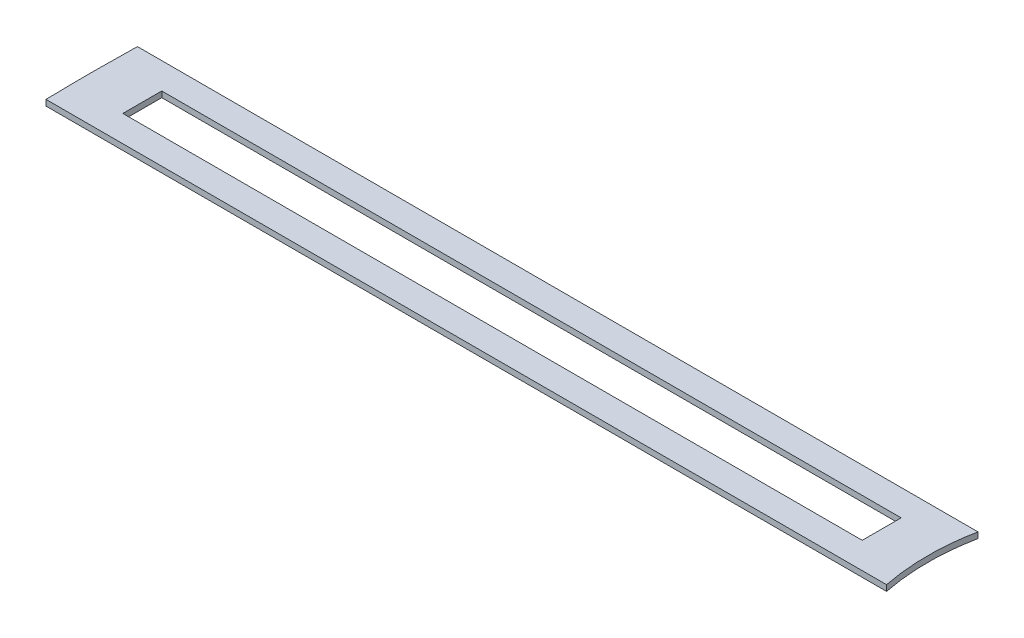
ISO-10303-21;
HEADER;
FILE_DESCRIPTION(('STEP AP214'),'2;1');
FILE_NAME('part.step','',(''),(''),'','','');
FILE_SCHEMA(('AUTOMOTIVE_DESIGN { 1 0 10303 214 1 1 1 1 }'));
ENDSEC;
DATA;
#1=APPLICATION_CONTEXT('core data for automotive mechanical design processes');
#2=APPLICATION_PROTOCOL_DEFINITION('international standard','automotive_design',2000,#1);
#3=PRODUCT_CONTEXT('',#1,'mechanical');
#4=PRODUCT('Part','Part','',(#3));
#5=PRODUCT_RELATED_PRODUCT_CATEGORY('part','',(#4));
#6=PRODUCT_DEFINITION_FORMATION('','',#4);
#7=PRODUCT_DEFINITION_CONTEXT('part definition',#1,'design');
#8=PRODUCT_DEFINITION('design','',#6,#7);
#9=PRODUCT_DEFINITION_SHAPE('','',#8);
#10=(LENGTH_UNIT() NAMED_UNIT(*) SI_UNIT(.MILLI.,.METRE.));
#11=(NAMED_UNIT(*) PLANE_ANGLE_UNIT() SI_UNIT($,.RADIAN.));
#12=(NAMED_UNIT(*) SI_UNIT($,.STERADIAN.) SOLID_ANGLE_UNIT());
#13=UNCERTAINTY_MEASURE_WITH_UNIT(LENGTH_MEASURE(1.E-05),#10,'distance_accuracy_value','');
#14=(GEOMETRIC_REPRESENTATION_CONTEXT(3) GLOBAL_UNCERTAINTY_ASSIGNED_CONTEXT((#13)) GLOBAL_UNIT_ASSIGNED_CONTEXT((#10,
#11,#12)) REPRESENTATION_CONTEXT('',''));
#15=CARTESIAN_POINT('',(0.,0.,0.));
#16=DIRECTION('',(0.,0.,1.));
#17=DIRECTION('',(1.,0.,0.));
#18=AXIS2_PLACEMENT_3D('',#15,#16,#17);
#19=CARTESIAN_POINT('',(274.231366276179,1.5,1.2110701569534E-13));
#20=DIRECTION('',(0.,1.,0.));
#21=DIRECTION('',(0.,0.,1.));
#22=AXIS2_PLACEMENT_3D('',#19,#20,#21);
#23=PLANE('',#22);
#24=CARTESIAN_POINT('',(274.231366276179,1.5,1.2110701569534E-13));
#25=DIRECTION('',(0.,-1.,0.));
#26=DIRECTION('',(0.,0.,1.));
#27=AXIS2_PLACEMENT_3D('',#24,#25,#26);
#28=ELLIPSE('',#27,85.6389749867497,60.5558999469955);
#29=CARTESIAN_POINT('',(216.,1.5,23.5000000000001));
#30=VERTEX_POINT('',#29);
#31=CARTESIAN_POINT('',(216.,1.5,-23.5));
#32=VERTEX_POINT('',#31);
#33=EDGE_CURVE('E134',#30,#32,#28,.T.);
#34=ORIENTED_EDGE('',*,*,#33,.T.);
#35=DIRECTION('',(-1.,0.,0.));
#36=VECTOR('',#35,1.);
#37=CARTESIAN_POINT('',(-215.999999999999,1.5,-23.5000000000002));
#38=LINE('',#37,#36);
#39=CARTESIAN_POINT('',(-215.999999999997,1.5,-23.5000000000002));
#40=VERTEX_POINT('',#39);
#41=EDGE_CURVE('E138',#32,#40,#38,.T.);
#42=ORIENTED_EDGE('',*,*,#41,.T.);
#43=CARTESIAN_POINT('',(278.260597063814,1.5,0.));
#44=DIRECTION('',(0.,1.,0.));
#45=DIRECTION('',(0.,0.,1.));
#46=AXIS2_PLACEMENT_3D('',#43,#44,#45);
#47=ELLIPSE('',#46,699.384962391783,494.539849567125);
#48=CARTESIAN_POINT('',(-216.,1.5,23.4999999999999));
#49=VERTEX_POINT('',#48);
#50=EDGE_CURVE('E141',#40,#49,#47,.T.);
#51=ORIENTED_EDGE('',*,*,#50,.T.);
#52=DIRECTION('',(1.,0.,0.));
#53=VECTOR('',#52,1.);
#54=CARTESIAN_POINT('',(216.,1.5,23.5000000000001));
#55=LINE('',#54,#53);
#56=EDGE_CURVE('E144',#49,#30,#55,.T.);
#57=ORIENTED_EDGE('',*,*,#56,.T.);
#58=EDGE_LOOP('',(#34,#42,#51,#57));
#59=FACE_BOUND('',#58,.T.);
#60=DIRECTION('',(-1.,0.,0.));
#61=VECTOR('',#60,1.);
#62=CARTESIAN_POINT('',(-190.,1.5,-10.));
#63=LINE('',#62,#61);
#64=CARTESIAN_POINT('',(190.,1.5,-10.));
#65=VERTEX_POINT('',#64);
#66=CARTESIAN_POINT('',(-190.,1.5,-10.));
#67=VERTEX_POINT('',#66);
#68=EDGE_CURVE('E107',#65,#67,#63,.T.);
#69=ORIENTED_EDGE('',*,*,#68,.F.);
#70=DIRECTION('',(0.,0.,-1.));
#71=VECTOR('',#70,1.);
#72=CARTESIAN_POINT('',(190.,1.5,10.));
#73=LINE('',#72,#71);
#74=CARTESIAN_POINT('',(190.,1.5,10.));
#75=VERTEX_POINT('',#74);
#76=EDGE_CURVE('E99',#75,#65,#73,.T.);
#77=ORIENTED_EDGE('',*,*,#76,.F.);
#78=DIRECTION('',(1.,0.,0.));
#79=VECTOR('',#78,1.);
#80=CARTESIAN_POINT('',(-190.,1.5,10.));
#81=LINE('',#80,#79);
#82=CARTESIAN_POINT('',(-190.,1.5,10.));
#83=VERTEX_POINT('',#82);
#84=EDGE_CURVE('E121',#83,#75,#81,.T.);
#85=ORIENTED_EDGE('',*,*,#84,.F.);
#86=DIRECTION('',(0.,0.,1.));
#87=VECTOR('',#86,1.);
#88=CARTESIAN_POINT('',(-190.,1.5,10.));
#89=LINE('',#88,#87);
#90=EDGE_CURVE('E119',#67,#83,#89,.T.);
#91=ORIENTED_EDGE('',*,*,#90,.F.);
#92=EDGE_LOOP('',(#69,#77,#85,#91));
#93=FACE_BOUND('',#92,.T.);
#94=ADVANCED_FACE('F33',(#59,#93),#23,.T.);
#95=CARTESIAN_POINT('',(274.231366276179,-1.5,1.2110701569534E-13));
#96=DIRECTION('',(0.,1.,0.));
#97=DIRECTION('',(0.,0.,1.));
#98=AXIS2_PLACEMENT_3D('',#95,#96,#97);
#99=PLANE('',#98);
#100=CARTESIAN_POINT('',(274.231366276179,-1.5,1.2110701569534E-13));
#101=DIRECTION('',(0.,-1.,0.));
#102=DIRECTION('',(0.,0.,1.));
#103=AXIS2_PLACEMENT_3D('',#100,#101,#102);
#104=ELLIPSE('',#103,85.6389749867497,60.5558999469955);
#105=CARTESIAN_POINT('',(216.,-1.5,23.5000000000001));
#106=VERTEX_POINT('',#105);
#107=CARTESIAN_POINT('',(216.,-1.5,-23.5));
#108=VERTEX_POINT('',#107);
#109=EDGE_CURVE('E115',#106,#108,#104,.T.);
#110=ORIENTED_EDGE('',*,*,#109,.F.);
#111=DIRECTION('',(1.,0.,0.));
#112=VECTOR('',#111,1.);
#113=CARTESIAN_POINT('',(216.,-1.5,23.5000000000001));
#114=LINE('',#113,#112);
#115=CARTESIAN_POINT('',(-216.,-1.5,23.4999999999999));
#116=VERTEX_POINT('',#115);
#117=EDGE_CURVE('E139',#116,#106,#114,.T.);
#118=ORIENTED_EDGE('',*,*,#117,.F.);
#119=CARTESIAN_POINT('',(278.260597063814,-1.5,0.));
#120=DIRECTION('',(0.,1.,0.));
#121=DIRECTION('',(0.,0.,1.));
#122=AXIS2_PLACEMENT_3D('',#119,#120,#121);
#123=ELLIPSE('',#122,699.384962391783,494.539849567125);
#124=CARTESIAN_POINT('',(-215.999999999997,-1.5,-23.5000000000002));
#125=VERTEX_POINT('',#124);
#126=EDGE_CURVE('E250',#125,#116,#123,.T.);
#127=ORIENTED_EDGE('',*,*,#126,.F.);
#128=DIRECTION('',(-1.,0.,0.));
#129=VECTOR('',#128,1.);
#130=CARTESIAN_POINT('',(-215.999999999999,-1.5,-23.5000000000002));
#131=LINE('',#130,#129);
#132=EDGE_CURVE('E255',#108,#125,#131,.T.);
#133=ORIENTED_EDGE('',*,*,#132,.F.);
#134=EDGE_LOOP('',(#110,#118,#127,#133));
#135=FACE_BOUND('',#134,.T.);
#136=DIRECTION('',(0.,0.,-1.));
#137=VECTOR('',#136,1.);
#138=CARTESIAN_POINT('',(190.,-1.5,10.));
#139=LINE('',#138,#137);
#140=CARTESIAN_POINT('',(190.,-1.5,10.));
#141=VERTEX_POINT('',#140);
#142=CARTESIAN_POINT('',(190.,-1.5,-10.));
#143=VERTEX_POINT('',#142);
#144=EDGE_CURVE('E57',#141,#143,#139,.T.);
#145=ORIENTED_EDGE('',*,*,#144,.T.);
#146=DIRECTION('',(-1.,0.,0.));
#147=VECTOR('',#146,1.);
#148=CARTESIAN_POINT('',(-190.,-1.5,-10.));
#149=LINE('',#148,#147);
#150=CARTESIAN_POINT('',(-190.,-1.5,-10.));
#151=VERTEX_POINT('',#150);
#152=EDGE_CURVE('E114',#143,#151,#149,.T.);
#153=ORIENTED_EDGE('',*,*,#152,.T.);
#154=DIRECTION('',(0.,0.,1.));
#155=VECTOR('',#154,1.);
#156=CARTESIAN_POINT('',(-190.,-1.5,10.));
#157=LINE('',#156,#155);
#158=CARTESIAN_POINT('',(-190.,-1.5,10.));
#159=VERTEX_POINT('',#158);
#160=EDGE_CURVE('E127',#151,#159,#157,.T.);
#161=ORIENTED_EDGE('',*,*,#160,.T.);
#162=DIRECTION('',(1.,0.,0.));
#163=VECTOR('',#162,1.);
#164=CARTESIAN_POINT('',(-190.,-1.5,10.));
#165=LINE('',#164,#163);
#166=EDGE_CURVE('E108',#159,#141,#165,.T.);
#167=ORIENTED_EDGE('',*,*,#166,.T.);
#168=EDGE_LOOP('',(#145,#153,#161,#167));
#169=FACE_BOUND('',#168,.T.);
#170=ADVANCED_FACE('F159',(#135,#169),#99,.F.);
#171=DIRECTION('',(0.,-1.,0.));
#172=VECTOR('',#171,1.);
#173=SURFACE_OF_LINEAR_EXTRUSION('',#28,#172);
#174=ORIENTED_EDGE('',*,*,#109,.T.);
#175=DIRECTION('',(0.,-1.,0.));
#176=VECTOR('',#175,1.);
#177=CARTESIAN_POINT('',(216.,1.5,-23.5));
#178=LINE('',#177,#176);
#179=EDGE_CURVE('E11',#32,#108,#178,.T.);
#180=ORIENTED_EDGE('',*,*,#179,.F.);
#181=ORIENTED_EDGE('',*,*,#33,.F.);
#182=DIRECTION('',(0.,-1.,0.));
#183=VECTOR('',#182,1.);
#184=CARTESIAN_POINT('',(216.,1.5,23.5000000000001));
#185=LINE('',#184,#183);
#186=EDGE_CURVE('E244',#30,#106,#185,.T.);
#187=ORIENTED_EDGE('',*,*,#186,.T.);
#188=EDGE_LOOP('',(#174,#180,#181,#187));
#189=FACE_BOUND('',#188,.T.);
#190=ADVANCED_FACE('F35',(#189),#173,.F.);
#191=CARTESIAN_POINT('',(-215.999999999999,1.5,-23.5000000000002));
#192=DIRECTION('',(0.,0.,1.));
#193=DIRECTION('',(1.,0.,0.));
#194=AXIS2_PLACEMENT_3D('',#191,#192,#193);
#195=PLANE('',#194);
#196=ORIENTED_EDGE('',*,*,#132,.T.);
#197=DIRECTION('',(0.,-1.,0.));
#198=VECTOR('',#197,1.);
#199=CARTESIAN_POINT('',(-215.999999999997,1.5,-23.5000000000002));
#200=LINE('',#199,#198);
#201=EDGE_CURVE('E42',#40,#125,#200,.T.);
#202=ORIENTED_EDGE('',*,*,#201,.F.);
#203=ORIENTED_EDGE('',*,*,#41,.F.);
#204=ORIENTED_EDGE('',*,*,#179,.T.);
#205=EDGE_LOOP('',(#196,#202,#203,#204));
#206=FACE_BOUND('',#205,.T.);
#207=ADVANCED_FACE('F151',(#206),#195,.F.);
#208=DIRECTION('',(0.,-1.,0.));
#209=VECTOR('',#208,1.);
#210=SURFACE_OF_LINEAR_EXTRUSION('',#47,#209);
#211=ORIENTED_EDGE('',*,*,#126,.T.);
#212=DIRECTION('',(0.,-1.,0.));
#213=VECTOR('',#212,1.);
#214=CARTESIAN_POINT('',(-216.,1.5,23.4999999999999));
#215=LINE('',#214,#213);
#216=EDGE_CURVE('E247',#49,#116,#215,.T.);
#217=ORIENTED_EDGE('',*,*,#216,.F.);
#218=ORIENTED_EDGE('',*,*,#50,.F.);
#219=ORIENTED_EDGE('',*,*,#201,.T.);
#220=EDGE_LOOP('',(#211,#217,#218,#219));
#221=FACE_BOUND('',#220,.T.);
#222=ADVANCED_FACE('F147',(#221),#210,.F.);
#223=CARTESIAN_POINT('',(216.,1.5,23.5000000000001));
#224=DIRECTION('',(0.,0.,-1.));
#225=DIRECTION('',(-1.,0.,0.));
#226=AXIS2_PLACEMENT_3D('',#223,#224,#225);
#227=PLANE('',#226);
#228=ORIENTED_EDGE('',*,*,#117,.T.);
#229=ORIENTED_EDGE('',*,*,#186,.F.);
#230=ORIENTED_EDGE('',*,*,#56,.F.);
#231=ORIENTED_EDGE('',*,*,#216,.T.);
#232=EDGE_LOOP('',(#228,#229,#230,#231));
#233=FACE_BOUND('',#232,.T.);
#234=ADVANCED_FACE('F150',(#233),#227,.F.);
#235=CARTESIAN_POINT('',(190.,1.5,10.));
#236=DIRECTION('',(-1.,0.,0.));
#237=DIRECTION('',(0.,0.,1.));
#238=AXIS2_PLACEMENT_3D('',#235,#236,#237);
#239=PLANE('',#238);
#240=ORIENTED_EDGE('',*,*,#144,.F.);
#241=DIRECTION('',(0.,-1.,0.));
#242=VECTOR('',#241,1.);
#243=CARTESIAN_POINT('',(190.,1.5,10.));
#244=LINE('',#243,#242);
#245=EDGE_CURVE('E103',#75,#141,#244,.T.);
#246=ORIENTED_EDGE('',*,*,#245,.F.);
#247=ORIENTED_EDGE('',*,*,#76,.T.);
#248=DIRECTION('',(0.,-1.,0.));
#249=VECTOR('',#248,1.);
#250=CARTESIAN_POINT('',(190.,1.5,-10.));
#251=LINE('',#250,#249);
#252=EDGE_CURVE('E102',#65,#143,#251,.T.);
#253=ORIENTED_EDGE('',*,*,#252,.T.);
#254=EDGE_LOOP('',(#240,#246,#247,#253));
#255=FACE_BOUND('',#254,.T.);
#256=ADVANCED_FACE('F101',(#255),#239,.T.);
#257=CARTESIAN_POINT('',(-190.,1.5,-10.));
#258=DIRECTION('',(0.,0.,1.));
#259=DIRECTION('',(1.,0.,0.));
#260=AXIS2_PLACEMENT_3D('',#257,#258,#259);
#261=PLANE('',#260);
#262=ORIENTED_EDGE('',*,*,#152,.F.);
#263=ORIENTED_EDGE('',*,*,#252,.F.);
#264=ORIENTED_EDGE('',*,*,#68,.T.);
#265=DIRECTION('',(0.,-1.,0.));
#266=VECTOR('',#265,1.);
#267=CARTESIAN_POINT('',(-190.,1.5,-10.));
#268=LINE('',#267,#266);
#269=EDGE_CURVE('E116',#67,#151,#268,.T.);
#270=ORIENTED_EDGE('',*,*,#269,.T.);
#271=EDGE_LOOP('',(#262,#263,#264,#270));
#272=FACE_BOUND('',#271,.T.);
#273=ADVANCED_FACE('F111',(#272),#261,.T.);
#274=CARTESIAN_POINT('',(-190.,1.5,10.));
#275=DIRECTION('',(1.,0.,0.));
#276=DIRECTION('',(0.,0.,-1.));
#277=AXIS2_PLACEMENT_3D('',#274,#275,#276);
#278=PLANE('',#277);
#279=ORIENTED_EDGE('',*,*,#160,.F.);
#280=ORIENTED_EDGE('',*,*,#269,.F.);
#281=ORIENTED_EDGE('',*,*,#90,.T.);
#282=DIRECTION('',(0.,-1.,0.));
#283=VECTOR('',#282,1.);
#284=CARTESIAN_POINT('',(-190.,1.5,10.));
#285=LINE('',#284,#283);
#286=EDGE_CURVE('E49',#83,#159,#285,.T.);
#287=ORIENTED_EDGE('',*,*,#286,.T.);
#288=EDGE_LOOP('',(#279,#280,#281,#287));
#289=FACE_BOUND('',#288,.T.);
#290=ADVANCED_FACE('F173',(#289),#278,.T.);
#291=CARTESIAN_POINT('',(-190.,1.5,10.));
#292=DIRECTION('',(0.,0.,-1.));
#293=DIRECTION('',(-1.,0.,0.));
#294=AXIS2_PLACEMENT_3D('',#291,#292,#293);
#295=PLANE('',#294);
#296=ORIENTED_EDGE('',*,*,#166,.F.);
#297=ORIENTED_EDGE('',*,*,#286,.F.);
#298=ORIENTED_EDGE('',*,*,#84,.T.);
#299=ORIENTED_EDGE('',*,*,#245,.T.);
#300=EDGE_LOOP('',(#296,#297,#298,#299));
#301=FACE_BOUND('',#300,.T.);
#302=ADVANCED_FACE('F176',(#301),#295,.T.);
#303=CLOSED_SHELL('',(#94,#170,#190,#207,#222,#234,#256,#273,#290,#302));
#304=MANIFOLD_SOLID_BREP('B2',#303);
#305=ADVANCED_BREP_SHAPE_REPRESENTATION('',(#18,#304),#14);
#306=SHAPE_DEFINITION_REPRESENTATION(#9,#305);
ENDSEC;
END-ISO-10303-21;
